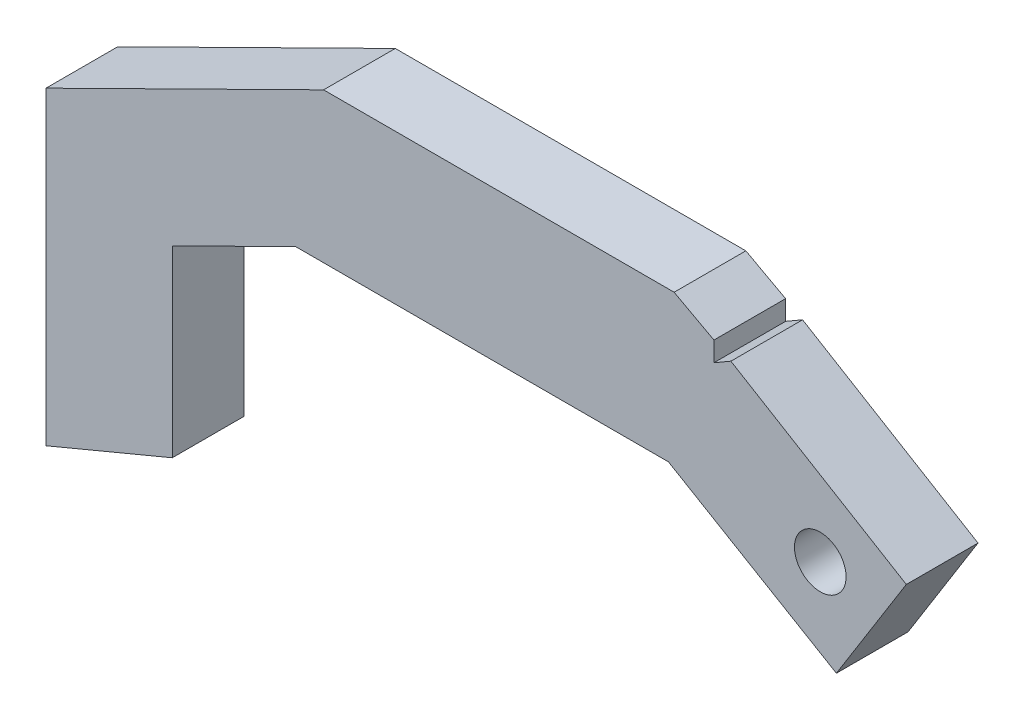
ISO-10303-21;
HEADER;
FILE_DESCRIPTION(('STEP AP214'),'2;1');
FILE_NAME('part.step','',(''),(''),'','','');
FILE_SCHEMA(('AUTOMOTIVE_DESIGN { 1 0 10303 214 1 1 1 1 }'));
ENDSEC;
DATA;
#1=APPLICATION_CONTEXT('core data for automotive mechanical design processes');
#2=APPLICATION_PROTOCOL_DEFINITION('international standard','automotive_design',2000,#1);
#3=PRODUCT_CONTEXT('',#1,'mechanical');
#4=PRODUCT('Part','Part','',(#3));
#5=PRODUCT_RELATED_PRODUCT_CATEGORY('part','',(#4));
#6=PRODUCT_DEFINITION_FORMATION('','',#4);
#7=PRODUCT_DEFINITION_CONTEXT('part definition',#1,'design');
#8=PRODUCT_DEFINITION('design','',#6,#7);
#9=PRODUCT_DEFINITION_SHAPE('','',#8);
#10=(LENGTH_UNIT() NAMED_UNIT(*) SI_UNIT(.MILLI.,.METRE.));
#11=(NAMED_UNIT(*) PLANE_ANGLE_UNIT() SI_UNIT($,.RADIAN.));
#12=(NAMED_UNIT(*) SI_UNIT($,.STERADIAN.) SOLID_ANGLE_UNIT());
#13=UNCERTAINTY_MEASURE_WITH_UNIT(LENGTH_MEASURE(1.E-05),#10,'distance_accuracy_value','');
#14=(GEOMETRIC_REPRESENTATION_CONTEXT(3) GLOBAL_UNCERTAINTY_ASSIGNED_CONTEXT((#13)) GLOBAL_UNIT_ASSIGNED_CONTEXT((#10,
#11,#12)) REPRESENTATION_CONTEXT('',''));
#15=CARTESIAN_POINT('',(0.,0.,0.));
#16=DIRECTION('',(0.,0.,1.));
#17=DIRECTION('',(1.,0.,0.));
#18=AXIS2_PLACEMENT_3D('',#15,#16,#17);
#19=CARTESIAN_POINT('',(0.,0.,3.175));
#20=DIRECTION('',(0.,0.,1.));
#21=DIRECTION('',(1.,0.,0.));
#22=AXIS2_PLACEMENT_3D('',#19,#20,#21);
#23=PLANE('',#22);
#24=DIRECTION('',(0.,1.,0.));
#25=VECTOR('',#24,1.);
#26=CARTESIAN_POINT('',(-13.8881921197148,-3.70750628365727,3.175));
#27=LINE('',#26,#25);
#28=CARTESIAN_POINT('',(-13.8881921197148,-4.57837368657546,3.175));
#29=VERTEX_POINT('',#28);
#30=CARTESIAN_POINT('',(-13.8881921197148,-3.70750628365727,3.175));
#31=VERTEX_POINT('',#30);
#32=EDGE_CURVE('E191',#29,#31,#27,.T.);
#33=ORIENTED_EDGE('',*,*,#32,.T.);
#34=DIRECTION('',(-0.879530987316726,0.475841614772883,0.));
#35=VECTOR('',#34,1.);
#36=CARTESIAN_POINT('',(-15.6494620801075,-2.75462849527935,3.175));
#37=LINE('',#36,#35);
#38=CARTESIAN_POINT('',(-15.6494620801075,-2.75462849527935,3.175));
#39=VERTEX_POINT('',#38);
#40=EDGE_CURVE('E114',#31,#39,#37,.T.);
#41=ORIENTED_EDGE('',*,*,#40,.T.);
#42=DIRECTION('',(-1.,0.,0.));
#43=VECTOR('',#42,1.);
#44=CARTESIAN_POINT('',(-15.6494620801075,-2.75462849527935,3.175));
#45=LINE('',#44,#43);
#46=CARTESIAN_POINT('',(-31.1740143635222,-2.75462849527935,3.175));
#47=VERTEX_POINT('',#46);
#48=EDGE_CURVE('E221',#39,#47,#45,.T.);
#49=ORIENTED_EDGE('',*,*,#48,.T.);
#50=DIRECTION('',(-0.896307695764986,-0.443432649353272,0.));
#51=VECTOR('',#50,1.);
#52=CARTESIAN_POINT('',(-31.1740143635222,-2.75462849527935,3.175));
#53=LINE('',#52,#51);
#54=CARTESIAN_POINT('',(-43.4677707186347,-8.83675071380883,3.175));
#55=VERTEX_POINT('',#54);
#56=EDGE_CURVE('E240',#47,#55,#53,.T.);
#57=ORIENTED_EDGE('',*,*,#56,.T.);
#58=DIRECTION('',(0.,-1.,0.));
#59=VECTOR('',#58,1.);
#60=CARTESIAN_POINT('',(-43.4677707186347,-8.83675071380883,3.175));
#61=LINE('',#60,#59);
#62=CARTESIAN_POINT('',(-43.4677707186347,-22.5527507138088,3.175));
#63=VERTEX_POINT('',#62);
#64=EDGE_CURVE('E237',#55,#63,#61,.T.);
#65=ORIENTED_EDGE('',*,*,#64,.T.);
#66=DIRECTION('',(0.922788619632822,0.385306583743584,0.));
#67=VECTOR('',#66,1.);
#68=CARTESIAN_POINT('',(-43.4677707186347,-22.5527507138088,3.175));
#69=LINE('',#68,#67);
#70=CARTESIAN_POINT('',(-37.8756915956669,-20.2178011304992,3.175));
#71=VERTEX_POINT('',#70);
#72=EDGE_CURVE('E239',#63,#71,#69,.T.);
#73=ORIENTED_EDGE('',*,*,#72,.T.);
#74=DIRECTION('',(0.,1.,0.));
#75=VECTOR('',#74,1.);
#76=CARTESIAN_POINT('',(-37.8756915956669,-20.2178011304992,3.175));
#77=LINE('',#76,#75);
#78=CARTESIAN_POINT('',(-37.8756915956669,-12.0898011304992,3.175));
#79=VERTEX_POINT('',#78);
#80=EDGE_CURVE('E242',#71,#79,#77,.T.);
#81=ORIENTED_EDGE('',*,*,#80,.T.);
#82=DIRECTION('',(0.896307695764986,0.443432649353272,0.));
#83=VECTOR('',#82,1.);
#84=CARTESIAN_POINT('',(-37.8756915956669,-12.0898011304992,3.175));
#85=LINE('',#84,#83);
#86=CARTESIAN_POINT('',(-32.4117998822835,-9.38663570004162,3.175));
#87=VERTEX_POINT('',#86);
#88=EDGE_CURVE('E248',#79,#87,#85,.T.);
#89=ORIENTED_EDGE('',*,*,#88,.T.);
#90=DIRECTION('',(1.,0.,0.));
#91=VECTOR('',#90,1.);
#92=CARTESIAN_POINT('',(-32.4117998822835,-9.38663570004162,3.175));
#93=LINE('',#92,#91);
#94=CARTESIAN_POINT('',(-15.9017998822835,-9.38663570004163,3.175));
#95=VERTEX_POINT('',#94);
#96=EDGE_CURVE('E250',#87,#95,#93,.T.);
#97=ORIENTED_EDGE('',*,*,#96,.T.);
#98=DIRECTION('',(0.861257443581233,-0.50816888519066,0.));
#99=VECTOR('',#98,1.);
#100=CARTESIAN_POINT('',(-15.9017998822835,-9.38663570004163,3.175));
#101=LINE('',#100,#99);
#102=CARTESIAN_POINT('',(-8.463980599516,-13.7751821925482,3.175));
#103=VERTEX_POINT('',#102);
#104=EDGE_CURVE('E148',#95,#103,#101,.T.);
#105=ORIENTED_EDGE('',*,*,#104,.T.);
#106=DIRECTION('',(0.52999142089717,0.848003003399987,0.));
#107=VECTOR('',#106,1.);
#108=CARTESIAN_POINT('',(-8.463980599516,-13.7751821925482,3.175));
#109=LINE('',#108,#107);
#110=CARTESIAN_POINT('',(-5.36777071863473,-8.82114864668545,3.175));
#111=VERTEX_POINT('',#110);
#112=EDGE_CURVE('E142',#103,#111,#109,.T.);
#113=ORIENTED_EDGE('',*,*,#112,.T.);
#114=DIRECTION('',(-0.856653850182167,0.515891636846411,0.));
#115=VECTOR('',#114,1.);
#116=CARTESIAN_POINT('',(-13.1360793626491,-4.14293998511636,3.175));
#117=LINE('',#116,#115);
#118=CARTESIAN_POINT('',(-13.1360793626491,-4.14293998511636,3.175));
#119=VERTEX_POINT('',#118);
#120=EDGE_CURVE('E146',#111,#119,#117,.T.);
#121=ORIENTED_EDGE('',*,*,#120,.T.);
#122=DIRECTION('',(-0.865426285481125,-0.501036270541707,0.));
#123=VECTOR('',#122,1.);
#124=CARTESIAN_POINT('',(-13.8881921197148,-4.57837368657546,3.175));
#125=LINE('',#124,#123);
#126=EDGE_CURVE('E56',#119,#29,#125,.T.);
#127=ORIENTED_EDGE('',*,*,#126,.T.);
#128=EDGE_LOOP('',(#33,#41,#49,#57,#65,#73,#81,#89,#97,#105,#113,#121,#127));
#129=FACE_BOUND('',#128,.T.);
#130=CARTESIAN_POINT('',(-9.17777071863474,-9.86512297351061,3.175));
#131=DIRECTION('',(0.,0.,1.));
#132=DIRECTION('',(1.,0.,0.));
#133=AXIS2_PLACEMENT_3D('',#130,#131,#132);
#134=CIRCLE('',#133,1.143);
#135=CARTESIAN_POINT('',(-8.03477071863474,-9.86512297351061,3.175));
#136=VERTEX_POINT('',#135);
#137=EDGE_CURVE('E170',#136,#136,#134,.T.);
#138=ORIENTED_EDGE('',*,*,#137,.F.);
#139=EDGE_LOOP('',(#138));
#140=FACE_BOUND('',#139,.T.);
#141=ADVANCED_FACE('F39',(#129,#140),#23,.T.);
#142=CARTESIAN_POINT('',(0.,0.,0.));
#143=DIRECTION('',(0.,0.,1.));
#144=DIRECTION('',(1.,0.,0.));
#145=AXIS2_PLACEMENT_3D('',#142,#143,#144);
#146=PLANE('',#145);
#147=DIRECTION('',(0.,1.,0.));
#148=VECTOR('',#147,1.);
#149=CARTESIAN_POINT('',(-13.8881921197148,-3.70750628365727,0.));
#150=LINE('',#149,#148);
#151=CARTESIAN_POINT('',(-13.8881921197148,-4.57837368657546,0.));
#152=VERTEX_POINT('',#151);
#153=CARTESIAN_POINT('',(-13.8881921197148,-3.70750628365727,0.));
#154=VERTEX_POINT('',#153);
#155=EDGE_CURVE('E166',#152,#154,#150,.T.);
#156=ORIENTED_EDGE('',*,*,#155,.F.);
#157=DIRECTION('',(-0.865426285481125,-0.501036270541707,0.));
#158=VECTOR('',#157,1.);
#159=CARTESIAN_POINT('',(-13.8881921197148,-4.57837368657546,0.));
#160=LINE('',#159,#158);
#161=CARTESIAN_POINT('',(-13.1360793626491,-4.14293998511636,0.));
#162=VERTEX_POINT('',#161);
#163=EDGE_CURVE('E106',#162,#152,#160,.T.);
#164=ORIENTED_EDGE('',*,*,#163,.F.);
#165=DIRECTION('',(-0.856653850182167,0.515891636846411,0.));
#166=VECTOR('',#165,1.);
#167=CARTESIAN_POINT('',(-13.1360793626491,-4.14293998511636,0.));
#168=LINE('',#167,#166);
#169=CARTESIAN_POINT('',(-5.36777071863473,-8.82114864668545,0.));
#170=VERTEX_POINT('',#169);
#171=EDGE_CURVE('E100',#170,#162,#168,.T.);
#172=ORIENTED_EDGE('',*,*,#171,.F.);
#173=DIRECTION('',(0.52999142089717,0.848003003399987,0.));
#174=VECTOR('',#173,1.);
#175=CARTESIAN_POINT('',(-8.463980599516,-13.7751821925482,0.));
#176=LINE('',#175,#174);
#177=CARTESIAN_POINT('',(-8.463980599516,-13.7751821925482,0.));
#178=VERTEX_POINT('',#177);
#179=EDGE_CURVE('E156',#178,#170,#176,.T.);
#180=ORIENTED_EDGE('',*,*,#179,.F.);
#181=DIRECTION('',(0.861257443581233,-0.50816888519066,0.));
#182=VECTOR('',#181,1.);
#183=CARTESIAN_POINT('',(-15.9017998822835,-9.38663570004163,0.));
#184=LINE('',#183,#182);
#185=CARTESIAN_POINT('',(-15.9017998822835,-9.38663570004163,0.));
#186=VERTEX_POINT('',#185);
#187=EDGE_CURVE('E186',#186,#178,#184,.T.);
#188=ORIENTED_EDGE('',*,*,#187,.F.);
#189=DIRECTION('',(1.,0.,0.));
#190=VECTOR('',#189,1.);
#191=CARTESIAN_POINT('',(-32.4117998822835,-9.38663570004162,0.));
#192=LINE('',#191,#190);
#193=CARTESIAN_POINT('',(-32.4117998822835,-9.38663570004162,0.));
#194=VERTEX_POINT('',#193);
#195=EDGE_CURVE('E184',#194,#186,#192,.T.);
#196=ORIENTED_EDGE('',*,*,#195,.F.);
#197=DIRECTION('',(0.896307695764986,0.443432649353272,0.));
#198=VECTOR('',#197,1.);
#199=CARTESIAN_POINT('',(-37.8756915956669,-12.0898011304992,0.));
#200=LINE('',#199,#198);
#201=CARTESIAN_POINT('',(-37.8756915956669,-12.0898011304992,0.));
#202=VERTEX_POINT('',#201);
#203=EDGE_CURVE('E182',#202,#194,#200,.T.);
#204=ORIENTED_EDGE('',*,*,#203,.F.);
#205=DIRECTION('',(0.,1.,0.));
#206=VECTOR('',#205,1.);
#207=CARTESIAN_POINT('',(-37.8756915956669,-20.2178011304992,0.));
#208=LINE('',#207,#206);
#209=CARTESIAN_POINT('',(-37.8756915956669,-20.2178011304992,0.));
#210=VERTEX_POINT('',#209);
#211=EDGE_CURVE('E180',#210,#202,#208,.T.);
#212=ORIENTED_EDGE('',*,*,#211,.F.);
#213=DIRECTION('',(0.922788619632822,0.385306583743584,0.));
#214=VECTOR('',#213,1.);
#215=CARTESIAN_POINT('',(-43.4677707186347,-22.5527507138088,0.));
#216=LINE('',#215,#214);
#217=CARTESIAN_POINT('',(-43.4677707186347,-22.5527507138088,0.));
#218=VERTEX_POINT('',#217);
#219=EDGE_CURVE('E178',#218,#210,#216,.T.);
#220=ORIENTED_EDGE('',*,*,#219,.F.);
#221=DIRECTION('',(0.,-1.,0.));
#222=VECTOR('',#221,1.);
#223=CARTESIAN_POINT('',(-43.4677707186347,-8.83675071380883,0.));
#224=LINE('',#223,#222);
#225=CARTESIAN_POINT('',(-43.4677707186347,-8.83675071380883,0.));
#226=VERTEX_POINT('',#225);
#227=EDGE_CURVE('E176',#226,#218,#224,.T.);
#228=ORIENTED_EDGE('',*,*,#227,.F.);
#229=DIRECTION('',(-0.896307695764986,-0.443432649353272,0.));
#230=VECTOR('',#229,1.);
#231=CARTESIAN_POINT('',(-31.1740143635222,-2.75462849527935,0.));
#232=LINE('',#231,#230);
#233=CARTESIAN_POINT('',(-31.1740143635222,-2.75462849527935,0.));
#234=VERTEX_POINT('',#233);
#235=EDGE_CURVE('E174',#234,#226,#232,.T.);
#236=ORIENTED_EDGE('',*,*,#235,.F.);
#237=DIRECTION('',(-1.,0.,0.));
#238=VECTOR('',#237,1.);
#239=CARTESIAN_POINT('',(-15.6494620801075,-2.75462849527935,0.));
#240=LINE('',#239,#238);
#241=CARTESIAN_POINT('',(-15.6494620801075,-2.75462849527935,0.));
#242=VERTEX_POINT('',#241);
#243=EDGE_CURVE('E172',#242,#234,#240,.T.);
#244=ORIENTED_EDGE('',*,*,#243,.F.);
#245=DIRECTION('',(-0.879530987316726,0.475841614772883,0.));
#246=VECTOR('',#245,1.);
#247=CARTESIAN_POINT('',(-15.6494620801075,-2.75462849527935,0.));
#248=LINE('',#247,#246);
#249=EDGE_CURVE('E169',#154,#242,#248,.T.);
#250=ORIENTED_EDGE('',*,*,#249,.F.);
#251=EDGE_LOOP('',(#156,#164,#172,#180,#188,#196,#204,#212,#220,#228,#236,#244,#250));
#252=FACE_BOUND('',#251,.T.);
#253=CARTESIAN_POINT('',(-9.17777071863474,-9.86512297351061,0.));
#254=DIRECTION('',(0.,0.,1.));
#255=DIRECTION('',(1.,0.,0.));
#256=AXIS2_PLACEMENT_3D('',#253,#254,#255);
#257=CIRCLE('',#256,1.143);
#258=CARTESIAN_POINT('',(-8.03477071863474,-9.86512297351061,0.));
#259=VERTEX_POINT('',#258);
#260=EDGE_CURVE('E410',#259,#259,#257,.T.);
#261=ORIENTED_EDGE('',*,*,#260,.T.);
#262=EDGE_LOOP('',(#261));
#263=FACE_BOUND('',#262,.T.);
#264=ADVANCED_FACE('F225',(#252,#263),#146,.F.);
#265=CARTESIAN_POINT('',(-13.8881921197148,-3.70750628365727,3.175));
#266=DIRECTION('',(-1.,0.,0.));
#267=DIRECTION('',(0.,0.,1.));
#268=AXIS2_PLACEMENT_3D('',#265,#266,#267);
#269=PLANE('',#268);
#270=ORIENTED_EDGE('',*,*,#155,.T.);
#271=DIRECTION('',(0.,0.,-1.));
#272=VECTOR('',#271,1.);
#273=CARTESIAN_POINT('',(-13.8881921197148,-3.70750628365727,3.175));
#274=LINE('',#273,#272);
#275=EDGE_CURVE('E11',#31,#154,#274,.T.);
#276=ORIENTED_EDGE('',*,*,#275,.F.);
#277=ORIENTED_EDGE('',*,*,#32,.F.);
#278=DIRECTION('',(0.,0.,-1.));
#279=VECTOR('',#278,1.);
#280=CARTESIAN_POINT('',(-13.8881921197148,-4.57837368657546,3.175));
#281=LINE('',#280,#279);
#282=EDGE_CURVE('E162',#29,#152,#281,.T.);
#283=ORIENTED_EDGE('',*,*,#282,.T.);
#284=EDGE_LOOP('',(#270,#276,#277,#283));
#285=FACE_BOUND('',#284,.T.);
#286=ADVANCED_FACE('F41',(#285),#269,.F.);
#287=CARTESIAN_POINT('',(-15.6494620801075,-2.75462849527935,3.175));
#288=DIRECTION('',(-0.475841614772883,-0.879530987316726,0.));
#289=DIRECTION('',(0.879530987316726,-0.475841614772883,0.));
#290=AXIS2_PLACEMENT_3D('',#287,#288,#289);
#291=PLANE('',#290);
#292=ORIENTED_EDGE('',*,*,#249,.T.);
#293=DIRECTION('',(0.,0.,-1.));
#294=VECTOR('',#293,1.);
#295=CARTESIAN_POINT('',(-15.6494620801075,-2.75462849527935,3.175));
#296=LINE('',#295,#294);
#297=EDGE_CURVE('E48',#39,#242,#296,.T.);
#298=ORIENTED_EDGE('',*,*,#297,.F.);
#299=ORIENTED_EDGE('',*,*,#40,.F.);
#300=ORIENTED_EDGE('',*,*,#275,.T.);
#301=EDGE_LOOP('',(#292,#298,#299,#300));
#302=FACE_BOUND('',#301,.T.);
#303=ADVANCED_FACE('F284',(#302),#291,.F.);
#304=CARTESIAN_POINT('',(-15.6494620801075,-2.75462849527935,3.175));
#305=DIRECTION('',(0.,-1.,0.));
#306=DIRECTION('',(1.,0.,0.));
#307=AXIS2_PLACEMENT_3D('',#304,#305,#306);
#308=PLANE('',#307);
#309=ORIENTED_EDGE('',*,*,#243,.T.);
#310=DIRECTION('',(0.,0.,-1.));
#311=VECTOR('',#310,1.);
#312=CARTESIAN_POINT('',(-31.1740143635222,-2.75462849527935,3.175));
#313=LINE('',#312,#311);
#314=EDGE_CURVE('E213',#47,#234,#313,.T.);
#315=ORIENTED_EDGE('',*,*,#314,.F.);
#316=ORIENTED_EDGE('',*,*,#48,.F.);
#317=ORIENTED_EDGE('',*,*,#297,.T.);
#318=EDGE_LOOP('',(#309,#315,#316,#317));
#319=FACE_BOUND('',#318,.T.);
#320=ADVANCED_FACE('F219',(#319),#308,.F.);
#321=CARTESIAN_POINT('',(-31.1740143635222,-2.75462849527935,3.175));
#322=DIRECTION('',(0.443432649353272,-0.896307695764985,0.));
#323=DIRECTION('',(0.896307695764986,0.443432649353272,0.));
#324=AXIS2_PLACEMENT_3D('',#321,#322,#323);
#325=PLANE('',#324);
#326=ORIENTED_EDGE('',*,*,#235,.T.);
#327=DIRECTION('',(0.,0.,-1.));
#328=VECTOR('',#327,1.);
#329=CARTESIAN_POINT('',(-43.4677707186347,-8.83675071380883,3.175));
#330=LINE('',#329,#328);
#331=EDGE_CURVE('E210',#55,#226,#330,.T.);
#332=ORIENTED_EDGE('',*,*,#331,.F.);
#333=ORIENTED_EDGE('',*,*,#56,.F.);
#334=ORIENTED_EDGE('',*,*,#314,.T.);
#335=EDGE_LOOP('',(#326,#332,#333,#334));
#336=FACE_BOUND('',#335,.T.);
#337=ADVANCED_FACE('F231',(#336),#325,.F.);
#338=CARTESIAN_POINT('',(-43.4677707186347,-8.83675071380883,3.175));
#339=DIRECTION('',(1.,0.,0.));
#340=DIRECTION('',(0.,0.,-1.));
#341=AXIS2_PLACEMENT_3D('',#338,#339,#340);
#342=PLANE('',#341);
#343=ORIENTED_EDGE('',*,*,#227,.T.);
#344=DIRECTION('',(0.,0.,-1.));
#345=VECTOR('',#344,1.);
#346=CARTESIAN_POINT('',(-43.4677707186347,-22.5527507138088,3.175));
#347=LINE('',#346,#345);
#348=EDGE_CURVE('E207',#63,#218,#347,.T.);
#349=ORIENTED_EDGE('',*,*,#348,.F.);
#350=ORIENTED_EDGE('',*,*,#64,.F.);
#351=ORIENTED_EDGE('',*,*,#331,.T.);
#352=EDGE_LOOP('',(#343,#349,#350,#351));
#353=FACE_BOUND('',#352,.T.);
#354=ADVANCED_FACE('F235',(#353),#342,.F.);
#355=CARTESIAN_POINT('',(-43.4677707186347,-22.5527507138088,3.175));
#356=DIRECTION('',(-0.385306583743584,0.922788619632822,0.));
#357=DIRECTION('',(-0.922788619632822,-0.385306583743584,0.));
#358=AXIS2_PLACEMENT_3D('',#355,#356,#357);
#359=PLANE('',#358);
#360=ORIENTED_EDGE('',*,*,#219,.T.);
#361=DIRECTION('',(0.,0.,-1.));
#362=VECTOR('',#361,1.);
#363=CARTESIAN_POINT('',(-37.8756915956669,-20.2178011304992,3.175));
#364=LINE('',#363,#362);
#365=EDGE_CURVE('E204',#71,#210,#364,.T.);
#366=ORIENTED_EDGE('',*,*,#365,.F.);
#367=ORIENTED_EDGE('',*,*,#72,.F.);
#368=ORIENTED_EDGE('',*,*,#348,.T.);
#369=EDGE_LOOP('',(#360,#366,#367,#368));
#370=FACE_BOUND('',#369,.T.);
#371=ADVANCED_FACE('F297',(#370),#359,.F.);
#372=CARTESIAN_POINT('',(-37.8756915956669,-20.2178011304992,3.175));
#373=DIRECTION('',(-1.,0.,0.));
#374=DIRECTION('',(0.,0.,1.));
#375=AXIS2_PLACEMENT_3D('',#372,#373,#374);
#376=PLANE('',#375);
#377=ORIENTED_EDGE('',*,*,#211,.T.);
#378=DIRECTION('',(0.,0.,-1.));
#379=VECTOR('',#378,1.);
#380=CARTESIAN_POINT('',(-37.8756915956669,-12.0898011304992,3.175));
#381=LINE('',#380,#379);
#382=EDGE_CURVE('E201',#79,#202,#381,.T.);
#383=ORIENTED_EDGE('',*,*,#382,.F.);
#384=ORIENTED_EDGE('',*,*,#80,.F.);
#385=ORIENTED_EDGE('',*,*,#365,.T.);
#386=EDGE_LOOP('',(#377,#383,#384,#385));
#387=FACE_BOUND('',#386,.T.);
#388=ADVANCED_FACE('F300',(#387),#376,.F.);
#389=CARTESIAN_POINT('',(-37.8756915956669,-12.0898011304992,3.175));
#390=DIRECTION('',(-0.443432649353272,0.896307695764986,0.));
#391=DIRECTION('',(-0.896307695764986,-0.443432649353272,0.));
#392=AXIS2_PLACEMENT_3D('',#389,#390,#391);
#393=PLANE('',#392);
#394=ORIENTED_EDGE('',*,*,#203,.T.);
#395=DIRECTION('',(0.,0.,-1.));
#396=VECTOR('',#395,1.);
#397=CARTESIAN_POINT('',(-32.4117998822835,-9.38663570004162,3.175));
#398=LINE('',#397,#396);
#399=EDGE_CURVE('E198',#87,#194,#398,.T.);
#400=ORIENTED_EDGE('',*,*,#399,.F.);
#401=ORIENTED_EDGE('',*,*,#88,.F.);
#402=ORIENTED_EDGE('',*,*,#382,.T.);
#403=EDGE_LOOP('',(#394,#400,#401,#402));
#404=FACE_BOUND('',#403,.T.);
#405=ADVANCED_FACE('F304',(#404),#393,.F.);
#406=CARTESIAN_POINT('',(-32.4117998822835,-9.38663570004162,3.175));
#407=DIRECTION('',(0.,1.,0.));
#408=DIRECTION('',(-1.,0.,0.));
#409=AXIS2_PLACEMENT_3D('',#406,#407,#408);
#410=PLANE('',#409);
#411=ORIENTED_EDGE('',*,*,#195,.T.);
#412=DIRECTION('',(0.,0.,-1.));
#413=VECTOR('',#412,1.);
#414=CARTESIAN_POINT('',(-15.9017998822835,-9.38663570004163,3.175));
#415=LINE('',#414,#413);
#416=EDGE_CURVE('E195',#95,#186,#415,.T.);
#417=ORIENTED_EDGE('',*,*,#416,.F.);
#418=ORIENTED_EDGE('',*,*,#96,.F.);
#419=ORIENTED_EDGE('',*,*,#399,.T.);
#420=EDGE_LOOP('',(#411,#417,#418,#419));
#421=FACE_BOUND('',#420,.T.);
#422=ADVANCED_FACE('F256',(#421),#410,.F.);
#423=CARTESIAN_POINT('',(-15.9017998822835,-9.38663570004163,3.175));
#424=DIRECTION('',(0.50816888519066,0.861257443581233,0.));
#425=DIRECTION('',(-0.861257443581234,0.50816888519066,0.));
#426=AXIS2_PLACEMENT_3D('',#423,#424,#425);
#427=PLANE('',#426);
#428=ORIENTED_EDGE('',*,*,#187,.T.);
#429=DIRECTION('',(0.,0.,-1.));
#430=VECTOR('',#429,1.);
#431=CARTESIAN_POINT('',(-8.463980599516,-13.7751821925482,3.175));
#432=LINE('',#431,#430);
#433=EDGE_CURVE('E157',#103,#178,#432,.T.);
#434=ORIENTED_EDGE('',*,*,#433,.F.);
#435=ORIENTED_EDGE('',*,*,#104,.F.);
#436=ORIENTED_EDGE('',*,*,#416,.T.);
#437=EDGE_LOOP('',(#428,#434,#435,#436));
#438=FACE_BOUND('',#437,.T.);
#439=ADVANCED_FACE('F260',(#438),#427,.F.);
#440=CARTESIAN_POINT('',(-8.463980599516,-13.7751821925482,3.175));
#441=DIRECTION('',(-0.848003003399987,0.52999142089717,0.));
#442=DIRECTION('',(-0.52999142089717,-0.848003003399987,0.));
#443=AXIS2_PLACEMENT_3D('',#440,#441,#442);
#444=PLANE('',#443);
#445=ORIENTED_EDGE('',*,*,#179,.T.);
#446=DIRECTION('',(0.,0.,-1.));
#447=VECTOR('',#446,1.);
#448=CARTESIAN_POINT('',(-5.36777071863473,-8.82114864668545,3.175));
#449=LINE('',#448,#447);
#450=EDGE_CURVE('E153',#111,#170,#449,.T.);
#451=ORIENTED_EDGE('',*,*,#450,.F.);
#452=ORIENTED_EDGE('',*,*,#112,.F.);
#453=ORIENTED_EDGE('',*,*,#433,.T.);
#454=EDGE_LOOP('',(#445,#451,#452,#453));
#455=FACE_BOUND('',#454,.T.);
#456=ADVANCED_FACE('F154',(#455),#444,.F.);
#457=CARTESIAN_POINT('',(-13.1360793626491,-4.14293998511636,3.175));
#458=DIRECTION('',(-0.515891636846411,-0.856653850182167,0.));
#459=DIRECTION('',(0.856653850182167,-0.515891636846411,0.));
#460=AXIS2_PLACEMENT_3D('',#457,#458,#459);
#461=PLANE('',#460);
#462=ORIENTED_EDGE('',*,*,#171,.T.);
#463=DIRECTION('',(0.,0.,-1.));
#464=VECTOR('',#463,1.);
#465=CARTESIAN_POINT('',(-13.1360793626491,-4.14293998511636,3.175));
#466=LINE('',#465,#464);
#467=EDGE_CURVE('E158',#119,#162,#466,.T.);
#468=ORIENTED_EDGE('',*,*,#467,.F.);
#469=ORIENTED_EDGE('',*,*,#120,.F.);
#470=ORIENTED_EDGE('',*,*,#450,.T.);
#471=EDGE_LOOP('',(#462,#468,#469,#470));
#472=FACE_BOUND('',#471,.T.);
#473=ADVANCED_FACE('F160',(#472),#461,.F.);
#474=CARTESIAN_POINT('',(-13.8881921197148,-4.57837368657546,3.175));
#475=DIRECTION('',(0.501036270541707,-0.865426285481125,0.));
#476=DIRECTION('',(0.865426285481125,0.501036270541707,0.));
#477=AXIS2_PLACEMENT_3D('',#474,#475,#476);
#478=PLANE('',#477);
#479=ORIENTED_EDGE('',*,*,#163,.T.);
#480=ORIENTED_EDGE('',*,*,#282,.F.);
#481=ORIENTED_EDGE('',*,*,#126,.F.);
#482=ORIENTED_EDGE('',*,*,#467,.T.);
#483=EDGE_LOOP('',(#479,#480,#481,#482));
#484=FACE_BOUND('',#483,.T.);
#485=ADVANCED_FACE('F264',(#484),#478,.F.);
#486=CARTESIAN_POINT('',(-9.17777071863474,-9.86512297351061,3.175));
#487=DIRECTION('',(0.,0.,-1.));
#488=DIRECTION('',(-1.,0.,0.));
#489=AXIS2_PLACEMENT_3D('',#486,#487,#488);
#490=CYLINDRICAL_SURFACE('',#489,1.143);
#491=ORIENTED_EDGE('',*,*,#137,.T.);
#492=EDGE_LOOP('',(#491));
#493=FACE_BOUND('',#492,.T.);
#494=ORIENTED_EDGE('',*,*,#260,.F.);
#495=EDGE_LOOP('',(#494));
#496=FACE_BOUND('',#495,.T.);
#497=ADVANCED_FACE('F266',(#493,#496),#490,.F.);
#498=CLOSED_SHELL('',(#141,#264,#286,#303,#320,#337,#354,#371,#388,#405,#422,#439,#456,#473,
#485,#497));
#499=MANIFOLD_SOLID_BREP('B2',#498);
#500=ADVANCED_BREP_SHAPE_REPRESENTATION('',(#18,#499),#14);
#501=SHAPE_DEFINITION_REPRESENTATION(#9,#500);
ENDSEC;
END-ISO-10303-21;
